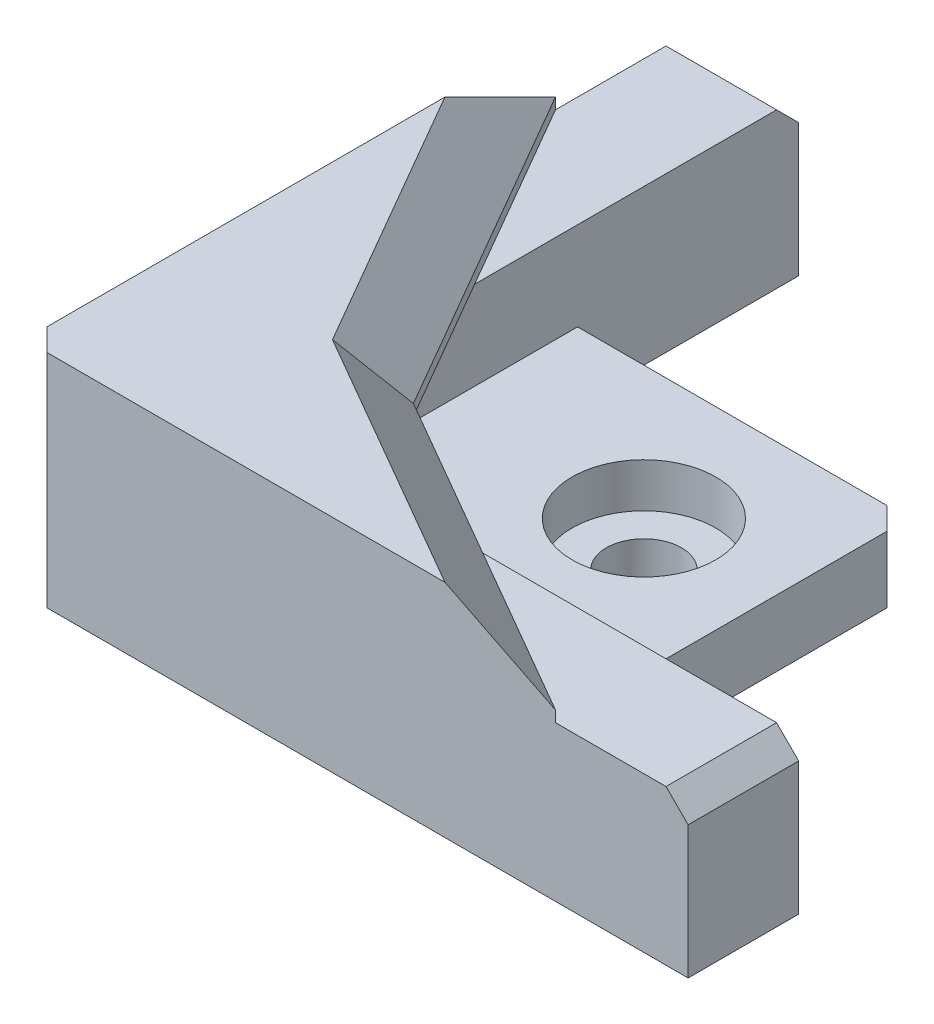
ISO-10303-21;
HEADER;
FILE_DESCRIPTION(('STEP AP214'),'2;1');
FILE_NAME('part.step','',(''),(''),'','','');
FILE_SCHEMA(('AUTOMOTIVE_DESIGN { 1 0 10303 214 1 1 1 1 }'));
ENDSEC;
DATA;
#1=APPLICATION_CONTEXT('core data for automotive mechanical design processes');
#2=APPLICATION_PROTOCOL_DEFINITION('international standard','automotive_design',2000,#1);
#3=PRODUCT_CONTEXT('',#1,'mechanical');
#4=PRODUCT('Part','Part','',(#3));
#5=PRODUCT_RELATED_PRODUCT_CATEGORY('part','',(#4));
#6=PRODUCT_DEFINITION_FORMATION('','',#4);
#7=PRODUCT_DEFINITION_CONTEXT('part definition',#1,'design');
#8=PRODUCT_DEFINITION('design','',#6,#7);
#9=PRODUCT_DEFINITION_SHAPE('','',#8);
#10=(LENGTH_UNIT() NAMED_UNIT(*) SI_UNIT(.MILLI.,.METRE.));
#11=(NAMED_UNIT(*) PLANE_ANGLE_UNIT() SI_UNIT($,.RADIAN.));
#12=(NAMED_UNIT(*) SI_UNIT($,.STERADIAN.) SOLID_ANGLE_UNIT());
#13=UNCERTAINTY_MEASURE_WITH_UNIT(LENGTH_MEASURE(1.E-05),#10,'distance_accuracy_value','');
#14=(GEOMETRIC_REPRESENTATION_CONTEXT(3) GLOBAL_UNCERTAINTY_ASSIGNED_CONTEXT((#13)) GLOBAL_UNIT_ASSIGNED_CONTEXT((#10,
#11,#12)) REPRESENTATION_CONTEXT('',''));
#15=CARTESIAN_POINT('',(0.,0.,0.));
#16=DIRECTION('',(0.,0.,1.));
#17=DIRECTION('',(1.,0.,0.));
#18=AXIS2_PLACEMENT_3D('',#15,#16,#17);
#19=CARTESIAN_POINT('',(0.,7.,0.));
#20=DIRECTION('',(0.,-1.,0.));
#21=DIRECTION('',(0.,0.,-1.));
#22=AXIS2_PLACEMENT_3D('',#19,#20,#21);
#23=PLANE('',#22);
#24=DIRECTION('',(0.,0.,-1.));
#25=VECTOR('',#24,1.);
#26=CARTESIAN_POINT('',(0.,7.,-25.));
#27=LINE('',#26,#25);
#28=CARTESIAN_POINT('',(0.,7.,-10.3452651016995));
#29=VERTEX_POINT('',#28);
#30=CARTESIAN_POINT('',(0.,7.,-24.));
#31=VERTEX_POINT('',#30);
#32=EDGE_CURVE('E416',#29,#31,#27,.T.);
#33=ORIENTED_EDGE('',*,*,#32,.T.);
#34=DIRECTION('',(-1.,0.,0.));
#35=VECTOR('',#34,1.);
#36=CARTESIAN_POINT('',(0.,7.,-24.));
#37=LINE('',#36,#35);
#38=CARTESIAN_POINT('',(-5.,7.,-24.));
#39=VERTEX_POINT('',#38);
#40=EDGE_CURVE('E296',#31,#39,#37,.T.);
#41=ORIENTED_EDGE('',*,*,#40,.T.);
#42=DIRECTION('',(0.,0.,1.));
#43=VECTOR('',#42,1.);
#44=CARTESIAN_POINT('',(-4.99999999999999,7.,5.));
#45=LINE('',#44,#43);
#46=CARTESIAN_POINT('',(-4.99999999999999,7.,-19.));
#47=VERTEX_POINT('',#46);
#48=EDGE_CURVE('E221',#39,#47,#45,.T.);
#49=ORIENTED_EDGE('',*,*,#48,.T.);
#50=DIRECTION('',(-0.500239080970221,0.,-0.865887326313343));
#51=VECTOR('',#50,1.);
#52=CARTESIAN_POINT('',(-5.00000000000001,7.,-19.));
#53=LINE('',#52,#51);
#54=EDGE_CURVE('E200',#29,#47,#53,.T.);
#55=ORIENTED_EDGE('',*,*,#54,.F.);
#56=EDGE_LOOP('',(#33,#41,#49,#55));
#57=FACE_BOUND('',#56,.T.);
#58=ADVANCED_FACE('F42',(#57),#23,.F.);
#59=DIRECTION('',(1.,0.,0.));
#60=VECTOR('',#59,1.);
#61=CARTESIAN_POINT('',(25.,7.,5.));
#62=LINE('',#61,#60);
#63=CARTESIAN_POINT('',(19.,7.,4.99999999999999));
#64=VERTEX_POINT('',#63);
#65=CARTESIAN_POINT('',(24.,7.,5.));
#66=VERTEX_POINT('',#65);
#67=EDGE_CURVE('E421',#64,#66,#62,.T.);
#68=ORIENTED_EDGE('',*,*,#67,.T.);
#69=DIRECTION('',(0.,0.,-1.));
#70=VECTOR('',#69,1.);
#71=CARTESIAN_POINT('',(24.,7.,0.));
#72=LINE('',#71,#70);
#73=CARTESIAN_POINT('',(24.,7.,0.));
#74=VERTEX_POINT('',#73);
#75=EDGE_CURVE('E303',#66,#74,#72,.T.);
#76=ORIENTED_EDGE('',*,*,#75,.T.);
#77=DIRECTION('',(-1.,0.,0.));
#78=VECTOR('',#77,1.);
#79=CARTESIAN_POINT('',(0.,7.,0.));
#80=LINE('',#79,#78);
#81=CARTESIAN_POINT('',(10.3452651016995,7.,0.));
#82=VERTEX_POINT('',#81);
#83=EDGE_CURVE('E418',#74,#82,#80,.T.);
#84=ORIENTED_EDGE('',*,*,#83,.T.);
#85=DIRECTION('',(-0.865887326313343,0.,-0.50023908097022));
#86=VECTOR('',#85,1.);
#87=CARTESIAN_POINT('',(3.78816036296214,7.,-3.78816036296214));
#88=LINE('',#87,#86);
#89=EDGE_CURVE('E189',#64,#82,#88,.T.);
#90=ORIENTED_EDGE('',*,*,#89,.F.);
#91=EDGE_LOOP('',(#68,#76,#84,#90));
#92=FACE_BOUND('',#91,.T.);
#93=ADVANCED_FACE('F322',(#92),#23,.F.);
#94=CARTESIAN_POINT('',(0.,0.,0.));
#95=DIRECTION('',(0.,1.,0.));
#96=DIRECTION('',(0.,0.,1.));
#97=AXIS2_PLACEMENT_3D('',#94,#95,#96);
#98=PLANE('',#97);
#99=CARTESIAN_POINT('',(9.,0.,-9.));
#100=DIRECTION('',(0.,1.,0.));
#101=DIRECTION('',(0.,0.,1.));
#102=AXIS2_PLACEMENT_3D('',#99,#100,#101);
#103=CIRCLE('',#102,4.);
#104=CARTESIAN_POINT('',(9.,0.,-4.99999999999999));
#105=VERTEX_POINT('',#104);
#106=EDGE_CURVE('E11',#105,#105,#103,.T.);
#107=ORIENTED_EDGE('',*,*,#106,.T.);
#108=EDGE_LOOP('',(#107));
#109=FACE_BOUND('',#108,.T.);
#110=DIRECTION('',(1.,0.,0.));
#111=VECTOR('',#110,1.);
#112=CARTESIAN_POINT('',(-4.99999999999999,0.,5.));
#113=LINE('',#112,#111);
#114=CARTESIAN_POINT('',(-3.99999999999999,0.,5.));
#115=VERTEX_POINT('',#114);
#116=CARTESIAN_POINT('',(25.,0.,5.));
#117=VERTEX_POINT('',#116);
#118=EDGE_CURVE('E238',#115,#117,#113,.T.);
#119=ORIENTED_EDGE('',*,*,#118,.F.);
#120=DIRECTION('',(0.707106781186545,0.,0.70710678118655));
#121=VECTOR('',#120,1.);
#122=CARTESIAN_POINT('',(-3.99999999999999,0.,5.));
#123=LINE('',#122,#121);
#124=CARTESIAN_POINT('',(-4.99999999999999,0.,3.99999999999998));
#125=VERTEX_POINT('',#124);
#126=EDGE_CURVE('E281',#115,#125,#123,.F.);
#127=ORIENTED_EDGE('',*,*,#126,.T.);
#128=DIRECTION('',(0.,0.,1.));
#129=VECTOR('',#128,1.);
#130=CARTESIAN_POINT('',(-5.,0.,-25.));
#131=LINE('',#130,#129);
#132=CARTESIAN_POINT('',(-5.,0.,-25.));
#133=VERTEX_POINT('',#132);
#134=EDGE_CURVE('E235',#133,#125,#131,.T.);
#135=ORIENTED_EDGE('',*,*,#134,.F.);
#136=DIRECTION('',(-1.,0.,0.));
#137=VECTOR('',#136,1.);
#138=CARTESIAN_POINT('',(0.,0.,-25.));
#139=LINE('',#138,#137);
#140=CARTESIAN_POINT('',(0.,0.,-25.));
#141=VERTEX_POINT('',#140);
#142=EDGE_CURVE('E225',#141,#133,#139,.T.);
#143=ORIENTED_EDGE('',*,*,#142,.F.);
#144=DIRECTION('',(0.,0.,-1.));
#145=VECTOR('',#144,1.);
#146=CARTESIAN_POINT('',(0.,0.,-15.));
#147=LINE('',#146,#145);
#148=CARTESIAN_POINT('',(0.,0.,-15.));
#149=VERTEX_POINT('',#148);
#150=EDGE_CURVE('E230',#149,#141,#147,.T.);
#151=ORIENTED_EDGE('',*,*,#150,.F.);
#152=DIRECTION('',(-1.,0.,0.));
#153=VECTOR('',#152,1.);
#154=CARTESIAN_POINT('',(0.,0.,-15.));
#155=LINE('',#154,#153);
#156=CARTESIAN_POINT('',(14.,0.,-15.));
#157=VERTEX_POINT('',#156);
#158=EDGE_CURVE('E249',#157,#149,#155,.T.);
#159=ORIENTED_EDGE('',*,*,#158,.F.);
#160=DIRECTION('',(-0.707106781186548,0.,-0.707106781186548));
#161=VECTOR('',#160,1.);
#162=CARTESIAN_POINT('',(14.,0.,-15.));
#163=LINE('',#162,#161);
#164=CARTESIAN_POINT('',(15.,0.,-14.));
#165=VERTEX_POINT('',#164);
#166=EDGE_CURVE('E279',#157,#165,#163,.F.);
#167=ORIENTED_EDGE('',*,*,#166,.T.);
#168=DIRECTION('',(0.,0.,-1.));
#169=VECTOR('',#168,1.);
#170=CARTESIAN_POINT('',(15.,0.,-15.));
#171=LINE('',#170,#169);
#172=CARTESIAN_POINT('',(15.,0.,0.));
#173=VERTEX_POINT('',#172);
#174=EDGE_CURVE('E246',#173,#165,#171,.T.);
#175=ORIENTED_EDGE('',*,*,#174,.F.);
#176=DIRECTION('',(-1.,0.,0.));
#177=VECTOR('',#176,1.);
#178=CARTESIAN_POINT('',(25.,0.,0.));
#179=LINE('',#178,#177);
#180=CARTESIAN_POINT('',(25.,0.,0.));
#181=VERTEX_POINT('',#180);
#182=EDGE_CURVE('E244',#181,#173,#179,.T.);
#183=ORIENTED_EDGE('',*,*,#182,.F.);
#184=DIRECTION('',(0.,0.,-1.));
#185=VECTOR('',#184,1.);
#186=CARTESIAN_POINT('',(25.,0.,5.));
#187=LINE('',#186,#185);
#188=EDGE_CURVE('E241',#117,#181,#187,.T.);
#189=ORIENTED_EDGE('',*,*,#188,.F.);
#190=EDGE_LOOP('',(#119,#127,#135,#143,#151,#159,#167,#175,#183,#189));
#191=FACE_BOUND('',#190,.T.);
#192=ADVANCED_FACE('F328',(#109,#191),#98,.F.);
#193=CARTESIAN_POINT('',(0.,3.,-25.));
#194=DIRECTION('',(0.,0.,1.));
#195=DIRECTION('',(1.,0.,0.));
#196=AXIS2_PLACEMENT_3D('',#193,#194,#195);
#197=PLANE('',#196);
#198=DIRECTION('',(0.,-1.,0.));
#199=VECTOR('',#198,1.);
#200=CARTESIAN_POINT('',(-5.,3.,-25.));
#201=LINE('',#200,#199);
#202=CARTESIAN_POINT('',(-5.,6.,-25.));
#203=VERTEX_POINT('',#202);
#204=EDGE_CURVE('E209',#203,#133,#201,.T.);
#205=ORIENTED_EDGE('',*,*,#204,.F.);
#206=DIRECTION('',(1.,0.,0.));
#207=VECTOR('',#206,1.);
#208=CARTESIAN_POINT('',(0.,6.,-25.));
#209=LINE('',#208,#207);
#210=CARTESIAN_POINT('',(0.,6.,-25.));
#211=VERTEX_POINT('',#210);
#212=EDGE_CURVE('E299',#203,#211,#209,.T.);
#213=ORIENTED_EDGE('',*,*,#212,.T.);
#214=DIRECTION('',(0.,-1.,0.));
#215=VECTOR('',#214,1.);
#216=CARTESIAN_POINT('',(0.,3.,-25.));
#217=LINE('',#216,#215);
#218=EDGE_CURVE('E232',#211,#141,#217,.T.);
#219=ORIENTED_EDGE('',*,*,#218,.T.);
#220=ORIENTED_EDGE('',*,*,#142,.T.);
#221=EDGE_LOOP('',(#205,#213,#219,#220));
#222=FACE_BOUND('',#221,.T.);
#223=ADVANCED_FACE('F342',(#222),#197,.F.);
#224=CARTESIAN_POINT('',(-5.,3.,-25.));
#225=DIRECTION('',(1.,0.,0.));
#226=DIRECTION('',(0.,0.,-1.));
#227=AXIS2_PLACEMENT_3D('',#224,#225,#226);
#228=PLANE('',#227);
#229=ORIENTED_EDGE('',*,*,#134,.T.);
#230=DIRECTION('',(0.,1.,0.));
#231=VECTOR('',#230,1.);
#232=CARTESIAN_POINT('',(-4.99999999999999,3.,3.99999999999999));
#233=LINE('',#232,#231);
#234=CARTESIAN_POINT('',(-4.99999999999999,10.,3.99999999999999));
#235=VERTEX_POINT('',#234);
#236=EDGE_CURVE('E285',#125,#235,#233,.T.);
#237=ORIENTED_EDGE('',*,*,#236,.T.);
#238=DIRECTION('',(0.,0.,1.));
#239=VECTOR('',#238,1.);
#240=CARTESIAN_POINT('',(-4.99999999999999,10.,5.));
#241=LINE('',#240,#239);
#242=CARTESIAN_POINT('',(-5.00000000000001,10.,-14.0023896670544));
#243=VERTEX_POINT('',#242);
#244=EDGE_CURVE('E201',#243,#235,#241,.T.);
#245=ORIENTED_EDGE('',*,*,#244,.F.);
#246=DIRECTION('',(0.,0.447384643376357,0.894341646615548));
#247=VECTOR('',#246,1.);
#248=CARTESIAN_POINT('',(-5.,15.0671316779998,-3.87296981410713));
#249=LINE('',#248,#247);
#250=CARTESIAN_POINT('',(-5.00000000000001,7.49999999999999,-19.));
#251=VERTEX_POINT('',#250);
#252=EDGE_CURVE('E270',#243,#251,#249,.F.);
#253=ORIENTED_EDGE('',*,*,#252,.T.);
#254=DIRECTION('',(0.,-1.,0.));
#255=VECTOR('',#254,1.);
#256=CARTESIAN_POINT('',(-5.00000000000001,10.,-19.));
#257=LINE('',#256,#255);
#258=EDGE_CURVE('E182',#251,#47,#257,.T.);
#259=ORIENTED_EDGE('',*,*,#258,.T.);
#260=ORIENTED_EDGE('',*,*,#48,.F.);
#261=DIRECTION('',(0.,0.707106781186548,0.707106781186548));
#262=VECTOR('',#261,1.);
#263=CARTESIAN_POINT('',(-5.,7.,-24.));
#264=LINE('',#263,#262);
#265=EDGE_CURVE('E283',#39,#203,#264,.F.);
#266=ORIENTED_EDGE('',*,*,#265,.T.);
#267=ORIENTED_EDGE('',*,*,#204,.T.);
#268=EDGE_LOOP('',(#229,#237,#245,#253,#259,#260,#266,#267));
#269=FACE_BOUND('',#268,.T.);
#270=ADVANCED_FACE('F365',(#269),#228,.F.);
#271=CARTESIAN_POINT('',(-4.99999999999999,3.,5.));
#272=DIRECTION('',(0.,0.,-1.));
#273=DIRECTION('',(-1.,0.,0.));
#274=AXIS2_PLACEMENT_3D('',#271,#272,#273);
#275=PLANE('',#274);
#276=DIRECTION('',(1.,0.,0.));
#277=VECTOR('',#276,1.);
#278=CARTESIAN_POINT('',(19.,10.,5.));
#279=LINE('',#278,#277);
#280=CARTESIAN_POINT('',(-3.99999999999999,10.,5.));
#281=VERTEX_POINT('',#280);
#282=CARTESIAN_POINT('',(14.0023896670544,10.,5.));
#283=VERTEX_POINT('',#282);
#284=EDGE_CURVE('E198',#281,#283,#279,.T.);
#285=ORIENTED_EDGE('',*,*,#284,.F.);
#286=DIRECTION('',(0.,-1.,0.));
#287=VECTOR('',#286,1.);
#288=CARTESIAN_POINT('',(-3.99999999999999,3.,5.));
#289=LINE('',#288,#287);
#290=EDGE_CURVE('E276',#281,#115,#289,.T.);
#291=ORIENTED_EDGE('',*,*,#290,.T.);
#292=ORIENTED_EDGE('',*,*,#118,.T.);
#293=DIRECTION('',(0.,-1.,0.));
#294=VECTOR('',#293,1.);
#295=CARTESIAN_POINT('',(25.,3.,5.));
#296=LINE('',#295,#294);
#297=CARTESIAN_POINT('',(25.,6.,5.));
#298=VERTEX_POINT('',#297);
#299=EDGE_CURVE('E213',#298,#117,#296,.T.);
#300=ORIENTED_EDGE('',*,*,#299,.F.);
#301=DIRECTION('',(0.707106781186549,-0.707106781186546,0.));
#302=VECTOR('',#301,1.);
#303=CARTESIAN_POINT('',(24.,7.,5.));
#304=LINE('',#303,#302);
#305=EDGE_CURVE('E273',#298,#66,#304,.F.);
#306=ORIENTED_EDGE('',*,*,#305,.T.);
#307=ORIENTED_EDGE('',*,*,#67,.F.);
#308=DIRECTION('',(0.,-1.,0.));
#309=VECTOR('',#308,1.);
#310=CARTESIAN_POINT('',(19.,10.,5.));
#311=LINE('',#310,#309);
#312=CARTESIAN_POINT('',(19.,7.49999999999999,5.));
#313=VERTEX_POINT('',#312);
#314=EDGE_CURVE('E181',#313,#64,#311,.T.);
#315=ORIENTED_EDGE('',*,*,#314,.F.);
#316=DIRECTION('',(0.894341646615548,-0.447384643376357,0.));
#317=VECTOR('',#316,1.);
#318=CARTESIAN_POINT('',(3.87296981410713,15.0671316779998,5.));
#319=LINE('',#318,#317);
#320=EDGE_CURVE('E267',#313,#283,#319,.F.);
#321=ORIENTED_EDGE('',*,*,#320,.T.);
#322=EDGE_LOOP('',(#285,#291,#292,#300,#306,#307,#315,#321));
#323=FACE_BOUND('',#322,.T.);
#324=ADVANCED_FACE('F361',(#323),#275,.F.);
#325=CARTESIAN_POINT('',(25.,3.,5.));
#326=DIRECTION('',(-1.,0.,0.));
#327=DIRECTION('',(0.,0.,1.));
#328=AXIS2_PLACEMENT_3D('',#325,#326,#327);
#329=PLANE('',#328);
#330=DIRECTION('',(0.,-1.,0.));
#331=VECTOR('',#330,1.);
#332=CARTESIAN_POINT('',(25.,3.,0.));
#333=LINE('',#332,#331);
#334=CARTESIAN_POINT('',(25.,6.,0.));
#335=VERTEX_POINT('',#334);
#336=EDGE_CURVE('E260',#335,#181,#333,.T.);
#337=ORIENTED_EDGE('',*,*,#336,.F.);
#338=DIRECTION('',(0.,0.,1.));
#339=VECTOR('',#338,1.);
#340=CARTESIAN_POINT('',(25.,6.,5.));
#341=LINE('',#340,#339);
#342=EDGE_CURVE('E306',#335,#298,#341,.T.);
#343=ORIENTED_EDGE('',*,*,#342,.T.);
#344=ORIENTED_EDGE('',*,*,#299,.T.);
#345=ORIENTED_EDGE('',*,*,#188,.T.);
#346=EDGE_LOOP('',(#337,#343,#344,#345));
#347=FACE_BOUND('',#346,.T.);
#348=ADVANCED_FACE('F358',(#347),#329,.F.);
#349=CARTESIAN_POINT('',(25.,3.,0.));
#350=DIRECTION('',(0.,0.,1.));
#351=DIRECTION('',(1.,0.,0.));
#352=AXIS2_PLACEMENT_3D('',#349,#350,#351);
#353=PLANE('',#352);
#354=ORIENTED_EDGE('',*,*,#83,.F.);
#355=DIRECTION('',(-0.707106781186549,0.707106781186546,0.));
#356=VECTOR('',#355,1.);
#357=CARTESIAN_POINT('',(24.,7.,0.));
#358=LINE('',#357,#356);
#359=EDGE_CURVE('E57',#74,#335,#358,.F.);
#360=ORIENTED_EDGE('',*,*,#359,.T.);
#361=ORIENTED_EDGE('',*,*,#336,.T.);
#362=ORIENTED_EDGE('',*,*,#182,.T.);
#363=DIRECTION('',(0.,-1.,0.));
#364=VECTOR('',#363,1.);
#365=CARTESIAN_POINT('',(15.,3.,0.));
#366=LINE('',#365,#364);
#367=CARTESIAN_POINT('',(15.,3.,0.));
#368=VERTEX_POINT('',#367);
#369=EDGE_CURVE('E257',#368,#173,#366,.T.);
#370=ORIENTED_EDGE('',*,*,#369,.F.);
#371=DIRECTION('',(-1.,0.,0.));
#372=VECTOR('',#371,1.);
#373=CARTESIAN_POINT('',(0.,3.,0.));
#374=LINE('',#373,#372);
#375=CARTESIAN_POINT('',(0.,3.,0.));
#376=VERTEX_POINT('',#375);
#377=EDGE_CURVE('E205',#368,#376,#374,.T.);
#378=ORIENTED_EDGE('',*,*,#377,.T.);
#379=DIRECTION('',(0.,-1.,0.));
#380=VECTOR('',#379,1.);
#381=CARTESIAN_POINT('',(0.,7.,0.));
#382=LINE('',#381,#380);
#383=CARTESIAN_POINT('',(0.,7.,0.));
#384=VERTEX_POINT('',#383);
#385=EDGE_CURVE('E223',#384,#376,#382,.T.);
#386=ORIENTED_EDGE('',*,*,#385,.F.);
#387=EDGE_CURVE('E419',#82,#384,#80,.T.);
#388=ORIENTED_EDGE('',*,*,#387,.F.);
#389=EDGE_LOOP('',(#354,#360,#361,#362,#370,#378,#386,#388));
#390=FACE_BOUND('',#389,.T.);
#391=ADVANCED_FACE('F354',(#390),#353,.F.);
#392=CARTESIAN_POINT('',(15.,3.,-15.));
#393=DIRECTION('',(-1.,0.,0.));
#394=DIRECTION('',(0.,0.,1.));
#395=AXIS2_PLACEMENT_3D('',#392,#393,#394);
#396=PLANE('',#395);
#397=ORIENTED_EDGE('',*,*,#174,.T.);
#398=DIRECTION('',(0.,1.,0.));
#399=VECTOR('',#398,1.);
#400=CARTESIAN_POINT('',(15.,3.,-14.));
#401=LINE('',#400,#399);
#402=CARTESIAN_POINT('',(15.,3.,-14.));
#403=VERTEX_POINT('',#402);
#404=EDGE_CURVE('E292',#165,#403,#401,.T.);
#405=ORIENTED_EDGE('',*,*,#404,.T.);
#406=DIRECTION('',(0.,0.,-1.));
#407=VECTOR('',#406,1.);
#408=CARTESIAN_POINT('',(15.,3.,-15.));
#409=LINE('',#408,#407);
#410=EDGE_CURVE('E226',#368,#403,#409,.T.);
#411=ORIENTED_EDGE('',*,*,#410,.F.);
#412=ORIENTED_EDGE('',*,*,#369,.T.);
#413=EDGE_LOOP('',(#397,#405,#411,#412));
#414=FACE_BOUND('',#413,.T.);
#415=ADVANCED_FACE('F350',(#414),#396,.F.);
#416=CARTESIAN_POINT('',(0.,3.,-15.));
#417=DIRECTION('',(0.,0.,1.));
#418=DIRECTION('',(1.,0.,0.));
#419=AXIS2_PLACEMENT_3D('',#416,#417,#418);
#420=PLANE('',#419);
#421=DIRECTION('',(-1.,0.,0.));
#422=VECTOR('',#421,1.);
#423=CARTESIAN_POINT('',(0.,3.,-15.));
#424=LINE('',#423,#422);
#425=CARTESIAN_POINT('',(14.,3.,-15.));
#426=VERTEX_POINT('',#425);
#427=CARTESIAN_POINT('',(0.,3.,-15.));
#428=VERTEX_POINT('',#427);
#429=EDGE_CURVE('E229',#426,#428,#424,.T.);
#430=ORIENTED_EDGE('',*,*,#429,.F.);
#431=DIRECTION('',(0.,-1.,0.));
#432=VECTOR('',#431,1.);
#433=CARTESIAN_POINT('',(14.,3.,-15.));
#434=LINE('',#433,#432);
#435=EDGE_CURVE('E289',#426,#157,#434,.T.);
#436=ORIENTED_EDGE('',*,*,#435,.T.);
#437=ORIENTED_EDGE('',*,*,#158,.T.);
#438=DIRECTION('',(0.,-1.,0.));
#439=VECTOR('',#438,1.);
#440=CARTESIAN_POINT('',(0.,3.,-15.));
#441=LINE('',#440,#439);
#442=EDGE_CURVE('E254',#428,#149,#441,.T.);
#443=ORIENTED_EDGE('',*,*,#442,.F.);
#444=EDGE_LOOP('',(#430,#436,#437,#443));
#445=FACE_BOUND('',#444,.T.);
#446=ADVANCED_FACE('F346',(#445),#420,.F.);
#447=CARTESIAN_POINT('',(0.,3.,-15.));
#448=DIRECTION('',(-1.,0.,0.));
#449=DIRECTION('',(0.,0.,1.));
#450=AXIS2_PLACEMENT_3D('',#447,#448,#449);
#451=PLANE('',#450);
#452=ORIENTED_EDGE('',*,*,#218,.F.);
#453=DIRECTION('',(0.,-0.707106781186548,-0.707106781186548));
#454=VECTOR('',#453,1.);
#455=CARTESIAN_POINT('',(0.,7.,-24.));
#456=LINE('',#455,#454);
#457=EDGE_CURVE('E301',#211,#31,#456,.F.);
#458=ORIENTED_EDGE('',*,*,#457,.T.);
#459=ORIENTED_EDGE('',*,*,#32,.F.);
#460=EDGE_CURVE('E197',#384,#29,#27,.T.);
#461=ORIENTED_EDGE('',*,*,#460,.F.);
#462=ORIENTED_EDGE('',*,*,#385,.T.);
#463=DIRECTION('',(0.,0.,-1.));
#464=VECTOR('',#463,1.);
#465=CARTESIAN_POINT('',(0.,3.,-25.));
#466=LINE('',#465,#464);
#467=EDGE_CURVE('E218',#376,#428,#466,.T.);
#468=ORIENTED_EDGE('',*,*,#467,.T.);
#469=ORIENTED_EDGE('',*,*,#442,.T.);
#470=ORIENTED_EDGE('',*,*,#150,.T.);
#471=EDGE_LOOP('',(#452,#458,#459,#461,#462,#468,#469,#470));
#472=FACE_BOUND('',#471,.T.);
#473=ADVANCED_FACE('F338',(#472),#451,.F.);
#474=CARTESIAN_POINT('',(0.,3.,0.));
#475=DIRECTION('',(0.,1.,0.));
#476=DIRECTION('',(0.,0.,1.));
#477=AXIS2_PLACEMENT_3D('',#474,#475,#476);
#478=PLANE('',#477);
#479=CARTESIAN_POINT('',(9.,3.,-9.));
#480=DIRECTION('',(0.,1.,0.));
#481=DIRECTION('',(0.,0.,1.));
#482=AXIS2_PLACEMENT_3D('',#479,#480,#481);
#483=CIRCLE('',#482,3.25);
#484=CARTESIAN_POINT('',(9.,3.,-5.75));
#485=VERTEX_POINT('',#484);
#486=EDGE_CURVE('E431',#485,#485,#483,.T.);
#487=ORIENTED_EDGE('',*,*,#486,.F.);
#488=EDGE_LOOP('',(#487));
#489=FACE_BOUND('',#488,.T.);
#490=ORIENTED_EDGE('',*,*,#410,.T.);
#491=DIRECTION('',(0.707106781186548,0.,0.707106781186548));
#492=VECTOR('',#491,1.);
#493=CARTESIAN_POINT('',(14.5,3.,-14.5));
#494=LINE('',#493,#492);
#495=EDGE_CURVE('E294',#403,#426,#494,.F.);
#496=ORIENTED_EDGE('',*,*,#495,.T.);
#497=ORIENTED_EDGE('',*,*,#429,.T.);
#498=ORIENTED_EDGE('',*,*,#467,.F.);
#499=ORIENTED_EDGE('',*,*,#377,.F.);
#500=EDGE_LOOP('',(#490,#496,#497,#498,#499));
#501=FACE_BOUND('',#500,.T.);
#502=ADVANCED_FACE('F335',(#489,#501),#478,.T.);
#503=CARTESIAN_POINT('',(9.,3.,-9.));
#504=DIRECTION('',(0.,1.,0.));
#505=DIRECTION('',(0.,0.,1.));
#506=AXIS2_PLACEMENT_3D('',#503,#504,#505);
#507=CYLINDRICAL_SURFACE('',#506,1.69999999999999);
#508=CARTESIAN_POINT('',(9.,0.999999999999998,-9.));
#509=DIRECTION('',(0.,1.,0.));
#510=DIRECTION('',(0.,0.,1.));
#511=AXIS2_PLACEMENT_3D('',#508,#509,#510);
#512=CIRCLE('',#511,1.69999999999999);
#513=CARTESIAN_POINT('',(9.,0.999999999999998,-7.3));
#514=VERTEX_POINT('',#513);
#515=EDGE_CURVE('E222',#514,#514,#512,.T.);
#516=ORIENTED_EDGE('',*,*,#515,.T.);
#517=EDGE_LOOP('',(#516));
#518=FACE_BOUND('',#517,.T.);
#519=CARTESIAN_POINT('',(9.,-2.5,-9.));
#520=DIRECTION('',(0.,-1.,0.));
#521=DIRECTION('',(0.,0.,-1.));
#522=AXIS2_PLACEMENT_3D('',#519,#520,#521);
#523=CIRCLE('',#522,1.69999999999999);
#524=CARTESIAN_POINT('',(9.,-2.5,-10.7));
#525=VERTEX_POINT('',#524);
#526=EDGE_CURVE('E437',#525,#525,#523,.T.);
#527=ORIENTED_EDGE('',*,*,#526,.T.);
#528=EDGE_LOOP('',(#527));
#529=FACE_BOUND('',#528,.T.);
#530=ADVANCED_FACE('F333',(#518,#529),#507,.F.);
#531=CARTESIAN_POINT('',(10.7,0.999999999999998,-9.));
#532=DIRECTION('',(0.,-1.,0.));
#533=DIRECTION('',(0.,0.,-1.));
#534=AXIS2_PLACEMENT_3D('',#531,#532,#533);
#535=PLANE('',#534);
#536=ORIENTED_EDGE('',*,*,#515,.F.);
#537=EDGE_LOOP('',(#536));
#538=FACE_BOUND('',#537,.T.);
#539=CARTESIAN_POINT('',(9.,0.999999999999998,-9.));
#540=DIRECTION('',(0.,1.,0.));
#541=DIRECTION('',(0.,0.,1.));
#542=AXIS2_PLACEMENT_3D('',#539,#540,#541);
#543=CIRCLE('',#542,3.25);
#544=CARTESIAN_POINT('',(9.,0.999999999999998,-5.75));
#545=VERTEX_POINT('',#544);
#546=EDGE_CURVE('E428',#545,#545,#543,.T.);
#547=ORIENTED_EDGE('',*,*,#546,.T.);
#548=EDGE_LOOP('',(#547));
#549=FACE_BOUND('',#548,.T.);
#550=ADVANCED_FACE('F495',(#538,#549),#535,.F.);
#551=CARTESIAN_POINT('',(9.,3.,-9.));
#552=DIRECTION('',(0.,1.,0.));
#553=DIRECTION('',(0.,0.,1.));
#554=AXIS2_PLACEMENT_3D('',#551,#552,#553);
#555=CYLINDRICAL_SURFACE('',#554,3.25);
#556=ORIENTED_EDGE('',*,*,#546,.F.);
#557=EDGE_LOOP('',(#556));
#558=FACE_BOUND('',#557,.T.);
#559=ORIENTED_EDGE('',*,*,#486,.T.);
#560=EDGE_LOOP('',(#559));
#561=FACE_BOUND('',#560,.T.);
#562=ADVANCED_FACE('F490',(#558,#561),#555,.F.);
#563=CARTESIAN_POINT('',(9.,-2.5,-9.));
#564=DIRECTION('',(0.,-1.,0.));
#565=DIRECTION('',(0.,0.,-1.));
#566=AXIS2_PLACEMENT_3D('',#563,#564,#565);
#567=PLANE('',#566);
#568=CARTESIAN_POINT('',(9.,-2.5,-9.));
#569=DIRECTION('',(0.,-1.,0.));
#570=DIRECTION('',(0.,0.,-1.));
#571=AXIS2_PLACEMENT_3D('',#568,#569,#570);
#572=CIRCLE('',#571,3.);
#573=CARTESIAN_POINT('',(9.,-2.5,-12.));
#574=VERTEX_POINT('',#573);
#575=EDGE_CURVE('E434',#574,#574,#572,.T.);
#576=ORIENTED_EDGE('',*,*,#575,.T.);
#577=EDGE_LOOP('',(#576));
#578=FACE_BOUND('',#577,.T.);
#579=ORIENTED_EDGE('',*,*,#526,.F.);
#580=EDGE_LOOP('',(#579));
#581=FACE_BOUND('',#580,.T.);
#582=ADVANCED_FACE('F487',(#578,#581),#567,.T.);
#583=CARTESIAN_POINT('',(9.,-2.5,-9.));
#584=DIRECTION('',(0.,1.,0.));
#585=DIRECTION('',(0.,0.,1.));
#586=AXIS2_PLACEMENT_3D('',#583,#584,#585);
#587=CYLINDRICAL_SURFACE('',#586,3.);
#588=CARTESIAN_POINT('',(9.,-1.,-9.));
#589=DIRECTION('',(0.,1.,0.));
#590=DIRECTION('',(0.,0.,1.));
#591=AXIS2_PLACEMENT_3D('',#588,#589,#590);
#592=CIRCLE('',#591,3.);
#593=CARTESIAN_POINT('',(9.,-1.,-5.99999999999999));
#594=VERTEX_POINT('',#593);
#595=EDGE_CURVE('E50',#594,#594,#592,.F.);
#596=ORIENTED_EDGE('',*,*,#595,.T.);
#597=EDGE_LOOP('',(#596));
#598=FACE_BOUND('',#597,.T.);
#599=ORIENTED_EDGE('',*,*,#575,.F.);
#600=EDGE_LOOP('',(#599));
#601=FACE_BOUND('',#600,.T.);
#602=ADVANCED_FACE('F310',(#598,#601),#587,.T.);
#603=CARTESIAN_POINT('',(3.78816036296214,10.,-3.78816036296214));
#604=DIRECTION('',(-0.50023908097022,0.,0.865887326313343));
#605=DIRECTION('',(0.865887326313343,0.,0.50023908097022));
#606=AXIS2_PLACEMENT_3D('',#603,#604,#605);
#607=PLANE('',#606);
#608=DIRECTION('',(0.,-1.,0.));
#609=VECTOR('',#608,1.);
#610=CARTESIAN_POINT('',(3.78816036296214,10.,-3.78816036296214));
#611=LINE('',#610,#609);
#612=CARTESIAN_POINT('',(3.78816036296214,7.49999999999999,-3.78816036296214));
#613=VERTEX_POINT('',#612);
#614=CARTESIAN_POINT('',(3.78816036296214,7.,-3.78816036296214));
#615=VERTEX_POINT('',#614);
#616=EDGE_CURVE('E170',#613,#615,#611,.T.);
#617=ORIENTED_EDGE('',*,*,#616,.F.);
#618=DIRECTION('',(0.865887326313343,0.,0.50023908097022));
#619=VECTOR('',#618,1.);
#620=CARTESIAN_POINT('',(3.78816036296214,7.49999999999999,-3.78816036296214));
#621=LINE('',#620,#619);
#622=EDGE_CURVE('E265',#613,#313,#621,.T.);
#623=ORIENTED_EDGE('',*,*,#622,.T.);
#624=ORIENTED_EDGE('',*,*,#314,.T.);
#625=ORIENTED_EDGE('',*,*,#89,.T.);
#626=EDGE_CURVE('E186',#82,#615,#88,.T.);
#627=ORIENTED_EDGE('',*,*,#626,.T.);
#628=EDGE_LOOP('',(#617,#623,#624,#625,#627));
#629=FACE_BOUND('',#628,.T.);
#630=ADVANCED_FACE('F187',(#629),#607,.F.);
#631=CARTESIAN_POINT('',(-5.00000000000001,10.,-19.));
#632=DIRECTION('',(-0.865887326313343,0.,0.500239080970221));
#633=DIRECTION('',(0.500239080970221,0.,0.865887326313343));
#634=AXIS2_PLACEMENT_3D('',#631,#632,#633);
#635=PLANE('',#634);
#636=ORIENTED_EDGE('',*,*,#258,.F.);
#637=DIRECTION('',(0.500239080970221,0.,0.865887326313343));
#638=VECTOR('',#637,1.);
#639=CARTESIAN_POINT('',(-5.00000000000001,7.49999999999999,-19.));
#640=LINE('',#639,#638);
#641=EDGE_CURVE('E178',#251,#613,#640,.T.);
#642=ORIENTED_EDGE('',*,*,#641,.T.);
#643=ORIENTED_EDGE('',*,*,#616,.T.);
#644=EDGE_CURVE('E176',#615,#29,#53,.T.);
#645=ORIENTED_EDGE('',*,*,#644,.T.);
#646=ORIENTED_EDGE('',*,*,#54,.T.);
#647=EDGE_LOOP('',(#636,#642,#643,#645,#646));
#648=FACE_BOUND('',#647,.T.);
#649=ADVANCED_FACE('F173',(#648),#635,.F.);
#650=CARTESIAN_POINT('',(0.,10.,0.));
#651=DIRECTION('',(0.,-1.,0.));
#652=DIRECTION('',(0.,0.,-1.));
#653=AXIS2_PLACEMENT_3D('',#650,#651,#652);
#654=PLANE('',#653);
#655=ORIENTED_EDGE('',*,*,#244,.T.);
#656=DIRECTION('',(-0.707106781186545,0.,-0.70710678118655));
#657=VECTOR('',#656,1.);
#658=CARTESIAN_POINT('',(-3.99999999999999,10.,5.));
#659=LINE('',#658,#657);
#660=EDGE_CURVE('E287',#235,#281,#659,.F.);
#661=ORIENTED_EDGE('',*,*,#660,.T.);
#662=ORIENTED_EDGE('',*,*,#284,.T.);
#663=DIRECTION('',(-0.865887326313343,0.,-0.50023908097022));
#664=VECTOR('',#663,1.);
#665=CARTESIAN_POINT('',(1.33819252034939,10.,-2.31634030130251));
#666=LINE('',#665,#664);
#667=CARTESIAN_POINT('',(1.95816865306536,10.,-1.95816865306536));
#668=VERTEX_POINT('',#667);
#669=EDGE_CURVE('E206',#283,#668,#666,.T.);
#670=ORIENTED_EDGE('',*,*,#669,.T.);
#671=DIRECTION('',(-0.500239080970221,0.,-0.865887326313343));
#672=VECTOR('',#671,1.);
#673=CARTESIAN_POINT('',(2.3163403013025,10.,-1.33819252034939));
#674=LINE('',#673,#672);
#675=EDGE_CURVE('E204',#668,#243,#674,.T.);
#676=ORIENTED_EDGE('',*,*,#675,.T.);
#677=EDGE_LOOP('',(#655,#661,#662,#670,#676));
#678=FACE_BOUND('',#677,.T.);
#679=ADVANCED_FACE('F446',(#678),#654,.F.);
#680=CARTESIAN_POINT('',(0.,7.,0.));
#681=DIRECTION('',(0.,-1.,0.));
#682=DIRECTION('',(0.,0.,-1.));
#683=AXIS2_PLACEMENT_3D('',#680,#681,#682);
#684=PLANE('',#683);
#685=ORIENTED_EDGE('',*,*,#626,.F.);
#686=ORIENTED_EDGE('',*,*,#387,.T.);
#687=ORIENTED_EDGE('',*,*,#460,.T.);
#688=ORIENTED_EDGE('',*,*,#644,.F.);
#689=EDGE_LOOP('',(#685,#686,#687,#688));
#690=FACE_BOUND('',#689,.T.);
#691=ADVANCED_FACE('F195',(#690),#684,.T.);
#692=CARTESIAN_POINT('',(2.31634030130251,10.,-1.33819252034939));
#693=DIRECTION('',(-0.612274800179655,-0.707106781186546,0.35372244636857));
#694=DIRECTION('',(-0.500239080970221,0.,-0.865887326313343));
#695=AXIS2_PLACEMENT_3D('',#692,#693,#694);
#696=PLANE('',#695);
#697=ORIENTED_EDGE('',*,*,#252,.F.);
#698=ORIENTED_EDGE('',*,*,#675,.F.);
#699=DIRECTION('',(0.508571652111124,-0.694773163944839,-0.508571652111125));
#700=VECTOR('',#699,1.);
#701=CARTESIAN_POINT('',(1.89045419936511,10.0925065033547,-1.89045419936511));
#702=LINE('',#701,#700);
#703=EDGE_CURVE('E192',#613,#668,#702,.F.);
#704=ORIENTED_EDGE('',*,*,#703,.F.);
#705=ORIENTED_EDGE('',*,*,#641,.F.);
#706=EDGE_LOOP('',(#697,#698,#704,#705));
#707=FACE_BOUND('',#706,.T.);
#708=ADVANCED_FACE('F382',(#707),#696,.F.);
#709=CARTESIAN_POINT('',(1.33819252034939,10.,-2.31634030130251));
#710=DIRECTION('',(-0.35372244636857,-0.707106781186546,0.612274800179655));
#711=DIRECTION('',(-0.865887326313343,0.,-0.50023908097022));
#712=AXIS2_PLACEMENT_3D('',#709,#710,#711);
#713=PLANE('',#712);
#714=ORIENTED_EDGE('',*,*,#320,.F.);
#715=ORIENTED_EDGE('',*,*,#622,.F.);
#716=ORIENTED_EDGE('',*,*,#703,.T.);
#717=ORIENTED_EDGE('',*,*,#669,.F.);
#718=EDGE_LOOP('',(#714,#715,#716,#717));
#719=FACE_BOUND('',#718,.T.);
#720=ADVANCED_FACE('F374',(#719),#713,.F.);
#721=CARTESIAN_POINT('',(-3.99999999999999,3.,5.));
#722=DIRECTION('',(0.70710678118655,0.,-0.707106781186545));
#723=DIRECTION('',(0.,-1.,0.));
#724=AXIS2_PLACEMENT_3D('',#721,#722,#723);
#725=PLANE('',#724);
#726=ORIENTED_EDGE('',*,*,#660,.F.);
#727=ORIENTED_EDGE('',*,*,#236,.F.);
#728=ORIENTED_EDGE('',*,*,#126,.F.);
#729=ORIENTED_EDGE('',*,*,#290,.F.);
#730=EDGE_LOOP('',(#726,#727,#728,#729));
#731=FACE_BOUND('',#730,.T.);
#732=ADVANCED_FACE('F381',(#731),#725,.F.);
#733=CARTESIAN_POINT('',(14.,3.,-15.));
#734=DIRECTION('',(-0.707106781186547,0.,0.707106781186547));
#735=DIRECTION('',(0.,-1.,0.));
#736=AXIS2_PLACEMENT_3D('',#733,#734,#735);
#737=PLANE('',#736);
#738=ORIENTED_EDGE('',*,*,#495,.F.);
#739=ORIENTED_EDGE('',*,*,#404,.F.);
#740=ORIENTED_EDGE('',*,*,#166,.F.);
#741=ORIENTED_EDGE('',*,*,#435,.F.);
#742=EDGE_LOOP('',(#738,#739,#740,#741));
#743=FACE_BOUND('',#742,.T.);
#744=ADVANCED_FACE('F394',(#743),#737,.F.);
#745=CARTESIAN_POINT('',(0.,7.,-24.));
#746=DIRECTION('',(0.,-0.707106781186547,0.707106781186547));
#747=DIRECTION('',(-1.,0.,0.));
#748=AXIS2_PLACEMENT_3D('',#745,#746,#747);
#749=PLANE('',#748);
#750=ORIENTED_EDGE('',*,*,#457,.F.);
#751=ORIENTED_EDGE('',*,*,#212,.F.);
#752=ORIENTED_EDGE('',*,*,#265,.F.);
#753=ORIENTED_EDGE('',*,*,#40,.F.);
#754=EDGE_LOOP('',(#750,#751,#752,#753));
#755=FACE_BOUND('',#754,.T.);
#756=ADVANCED_FACE('F319',(#755),#749,.F.);
#757=CARTESIAN_POINT('',(24.,7.,0.));
#758=DIRECTION('',(-0.707106781186546,-0.707106781186549,0.));
#759=DIRECTION('',(0.,0.,-1.));
#760=AXIS2_PLACEMENT_3D('',#757,#758,#759);
#761=PLANE('',#760);
#762=ORIENTED_EDGE('',*,*,#305,.F.);
#763=ORIENTED_EDGE('',*,*,#342,.F.);
#764=ORIENTED_EDGE('',*,*,#359,.F.);
#765=ORIENTED_EDGE('',*,*,#75,.F.);
#766=EDGE_LOOP('',(#762,#763,#764,#765));
#767=FACE_BOUND('',#766,.T.);
#768=ADVANCED_FACE('F314',(#767),#761,.F.);
#769=CARTESIAN_POINT('',(9.,-1.,-9.));
#770=DIRECTION('',(0.,1.,0.));
#771=DIRECTION('',(0.,0.,1.));
#772=AXIS2_PLACEMENT_3D('',#769,#770,#771);
#773=TOROIDAL_SURFACE('',#772,4.,1.);
#774=ORIENTED_EDGE('',*,*,#106,.F.);
#775=EDGE_LOOP('',(#774));
#776=FACE_BOUND('',#775,.T.);
#777=ORIENTED_EDGE('',*,*,#595,.F.);
#778=EDGE_LOOP('',(#777));
#779=FACE_BOUND('',#778,.T.);
#780=ADVANCED_FACE('F44',(#776,#779),#773,.F.);
#781=CLOSED_SHELL('',(#58,#93,#192,#223,#270,#324,#348,#391,#415,#446,#473,#502,#530,#550,#562,
#582,#602,#630,#649,#679,#691,#708,#720,#732,#744,#756,#768,#780));
#782=MANIFOLD_SOLID_BREP('B2',#781);
#783=ADVANCED_BREP_SHAPE_REPRESENTATION('',(#18,#782),#14);
#784=SHAPE_DEFINITION_REPRESENTATION(#9,#783);
ENDSEC;
END-ISO-10303-21;
